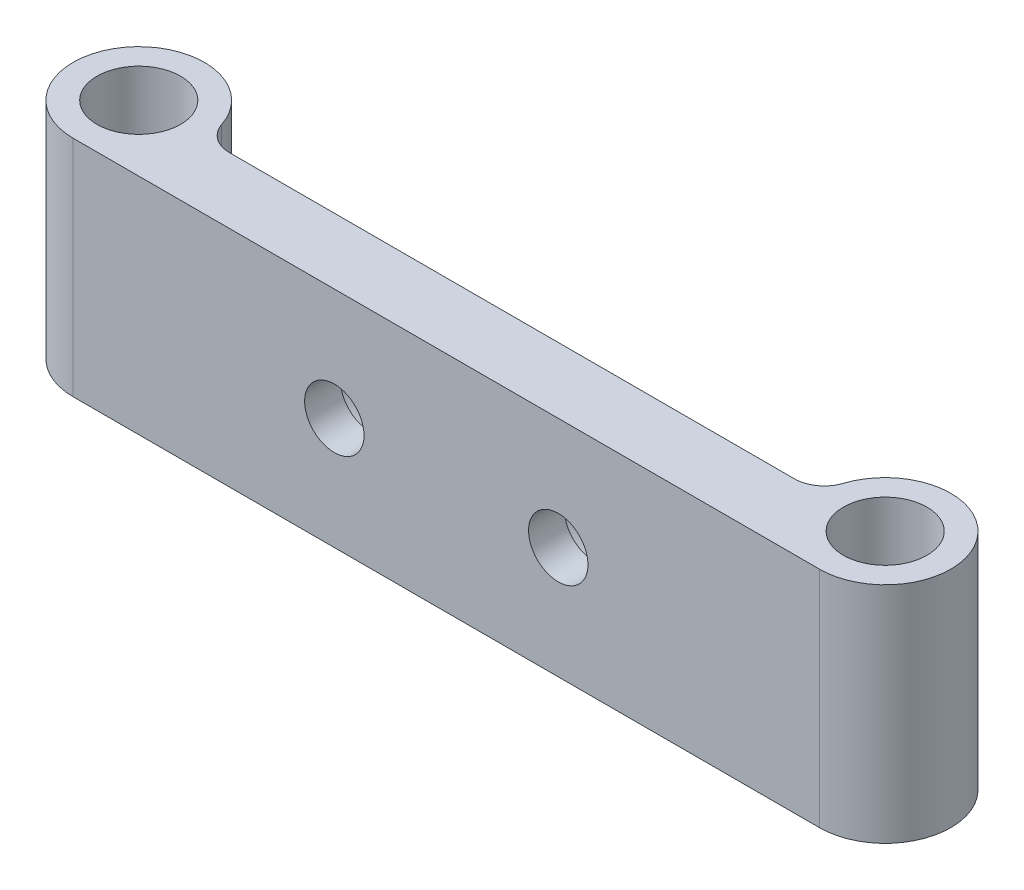
ISO-10303-21;
HEADER;
FILE_DESCRIPTION(('STEP AP214'),'2;1');
FILE_NAME('part.step','',(''),(''),'','','');
FILE_SCHEMA(('AUTOMOTIVE_DESIGN { 1 0 10303 214 1 1 1 1 }'));
ENDSEC;
DATA;
#1=APPLICATION_CONTEXT('core data for automotive mechanical design processes');
#2=APPLICATION_PROTOCOL_DEFINITION('international standard','automotive_design',2000,#1);
#3=PRODUCT_CONTEXT('',#1,'mechanical');
#4=PRODUCT('Part','Part','',(#3));
#5=PRODUCT_RELATED_PRODUCT_CATEGORY('part','',(#4));
#6=PRODUCT_DEFINITION_FORMATION('','',#4);
#7=PRODUCT_DEFINITION_CONTEXT('part definition',#1,'design');
#8=PRODUCT_DEFINITION('design','',#6,#7);
#9=PRODUCT_DEFINITION_SHAPE('','',#8);
#10=(LENGTH_UNIT() NAMED_UNIT(*) SI_UNIT(.MILLI.,.METRE.));
#11=(NAMED_UNIT(*) PLANE_ANGLE_UNIT() SI_UNIT($,.RADIAN.));
#12=(NAMED_UNIT(*) SI_UNIT($,.STERADIAN.) SOLID_ANGLE_UNIT());
#13=UNCERTAINTY_MEASURE_WITH_UNIT(LENGTH_MEASURE(1.E-05),#10,'distance_accuracy_value','');
#14=(GEOMETRIC_REPRESENTATION_CONTEXT(3) GLOBAL_UNCERTAINTY_ASSIGNED_CONTEXT((#13)) GLOBAL_UNIT_ASSIGNED_CONTEXT((#10,
#11,#12)) REPRESENTATION_CONTEXT('',''));
#15=CARTESIAN_POINT('',(0.,0.,0.));
#16=DIRECTION('',(0.,0.,1.));
#17=DIRECTION('',(1.,0.,0.));
#18=AXIS2_PLACEMENT_3D('',#15,#16,#17);
#19=CARTESIAN_POINT('',(9.525,9.525,0.));
#20=DIRECTION('',(0.,0.,1.));
#21=DIRECTION('',(1.,0.,0.));
#22=AXIS2_PLACEMENT_3D('',#19,#20,#21);
#23=CYLINDRICAL_SURFACE('',#22,2.5273);
#24=CARTESIAN_POINT('',(9.525,9.525,0.));
#25=DIRECTION('',(0.,0.,1.));
#26=DIRECTION('',(1.,0.,0.));
#27=AXIS2_PLACEMENT_3D('',#24,#25,#26);
#28=CIRCLE('',#27,2.5273);
#29=CARTESIAN_POINT('',(12.0523,9.525,0.));
#30=VERTEX_POINT('',#29);
#31=EDGE_CURVE('E155',#30,#30,#28,.T.);
#32=ORIENTED_EDGE('',*,*,#31,.T.);
#33=EDGE_LOOP('',(#32));
#34=FACE_BOUND('',#33,.T.);
#35=CARTESIAN_POINT('',(9.525,9.525,-3.04799999999999));
#36=DIRECTION('',(0.,0.,-1.));
#37=DIRECTION('',(-1.,0.,0.));
#38=AXIS2_PLACEMENT_3D('',#35,#36,#37);
#39=CIRCLE('',#38,2.5273);
#40=CARTESIAN_POINT('',(6.9977,9.525,-3.04799999999999));
#41=VERTEX_POINT('',#40);
#42=EDGE_CURVE('E43',#41,#41,#39,.F.);
#43=ORIENTED_EDGE('',*,*,#42,.F.);
#44=EDGE_LOOP('',(#43));
#45=FACE_BOUND('',#44,.T.);
#46=ADVANCED_FACE('F39',(#34,#45),#23,.F.);
#47=CARTESIAN_POINT('',(-9.525,9.525,0.));
#48=DIRECTION('',(0.,0.,1.));
#49=DIRECTION('',(1.,0.,0.));
#50=AXIS2_PLACEMENT_3D('',#47,#48,#49);
#51=CYLINDRICAL_SURFACE('',#50,2.5273);
#52=CARTESIAN_POINT('',(-9.525,9.525,0.));
#53=DIRECTION('',(0.,0.,1.));
#54=DIRECTION('',(1.,0.,0.));
#55=AXIS2_PLACEMENT_3D('',#52,#53,#54);
#56=CIRCLE('',#55,2.5273);
#57=CARTESIAN_POINT('',(-6.9977,9.525,0.));
#58=VERTEX_POINT('',#57);
#59=EDGE_CURVE('E138',#58,#58,#56,.T.);
#60=ORIENTED_EDGE('',*,*,#59,.T.);
#61=EDGE_LOOP('',(#60));
#62=FACE_BOUND('',#61,.T.);
#63=CARTESIAN_POINT('',(-9.525,9.525,-3.04799999999998));
#64=DIRECTION('',(0.,0.,-1.));
#65=DIRECTION('',(-1.,0.,0.));
#66=AXIS2_PLACEMENT_3D('',#63,#64,#65);
#67=CIRCLE('',#66,2.5273);
#68=CARTESIAN_POINT('',(-12.0523,9.525,-3.04799999999998));
#69=VERTEX_POINT('',#68);
#70=EDGE_CURVE('E132',#69,#69,#67,.F.);
#71=ORIENTED_EDGE('',*,*,#70,.F.);
#72=EDGE_LOOP('',(#71));
#73=FACE_BOUND('',#72,.T.);
#74=ADVANCED_FACE('F206',(#62,#73),#51,.F.);
#75=CARTESIAN_POINT('',(-31.75,19.05,-5.58799999999999));
#76=DIRECTION('',(0.,1.,0.));
#77=DIRECTION('',(0.,0.,1.));
#78=AXIS2_PLACEMENT_3D('',#75,#76,#77);
#79=PLANE('',#78);
#80=CARTESIAN_POINT('',(31.75,19.05,-5.588));
#81=DIRECTION('',(0.,1.,0.));
#82=DIRECTION('',(0.,0.,1.));
#83=AXIS2_PLACEMENT_3D('',#80,#81,#82);
#84=CIRCLE('',#83,3.556);
#85=CARTESIAN_POINT('',(31.75,19.05,-9.144));
#86=VERTEX_POINT('',#85);
#87=EDGE_CURVE('E165',#86,#86,#84,.T.);
#88=ORIENTED_EDGE('',*,*,#87,.F.);
#89=EDGE_LOOP('',(#88));
#90=FACE_BOUND('',#89,.T.);
#91=DIRECTION('',(-1.,0.,0.));
#92=VECTOR('',#91,1.);
#93=CARTESIAN_POINT('',(-26.162,19.05,-5.58799999999998));
#94=LINE('',#93,#92);
#95=CARTESIAN_POINT('',(24.0290684499861,19.05,-5.58799999999999));
#96=VERTEX_POINT('',#95);
#97=CARTESIAN_POINT('',(-24.0290684499861,19.05,-5.58799999999998));
#98=VERTEX_POINT('',#97);
#99=EDGE_CURVE('E118',#96,#98,#94,.T.);
#100=ORIENTED_EDGE('',*,*,#99,.T.);
#101=CARTESIAN_POINT('',(-24.0290684499861,19.05,-8.12799999999998));
#102=DIRECTION('',(0.,1.,0.));
#103=DIRECTION('',(0.,0.,1.));
#104=AXIS2_PLACEMENT_3D('',#101,#102,#103);
#105=CIRCLE('',#104,2.54);
#106=CARTESIAN_POINT('',(-26.4418595593655,19.05,-7.33424999999998));
#107=VERTEX_POINT('',#106);
#108=EDGE_CURVE('E11',#98,#107,#105,.F.);
#109=ORIENTED_EDGE('',*,*,#108,.T.);
#110=CARTESIAN_POINT('',(-31.75,19.05,-5.58799999999999));
#111=DIRECTION('',(0.,1.,0.));
#112=DIRECTION('',(0.,0.,1.));
#113=AXIS2_PLACEMENT_3D('',#110,#111,#112);
#114=CIRCLE('',#113,5.58799999999999);
#115=CARTESIAN_POINT('',(-31.75,19.05,0.));
#116=VERTEX_POINT('',#115);
#117=EDGE_CURVE('E90',#107,#116,#114,.T.);
#118=ORIENTED_EDGE('',*,*,#117,.T.);
#119=DIRECTION('',(1.,0.,0.));
#120=VECTOR('',#119,1.);
#121=CARTESIAN_POINT('',(-31.75,19.05,0.));
#122=LINE('',#121,#120);
#123=CARTESIAN_POINT('',(31.75,19.05,0.));
#124=VERTEX_POINT('',#123);
#125=EDGE_CURVE('E95',#116,#124,#122,.T.);
#126=ORIENTED_EDGE('',*,*,#125,.T.);
#127=CARTESIAN_POINT('',(31.75,19.05,-5.588));
#128=DIRECTION('',(0.,1.,0.));
#129=DIRECTION('',(0.,0.,1.));
#130=AXIS2_PLACEMENT_3D('',#127,#128,#129);
#131=CIRCLE('',#130,5.58799999999999);
#132=CARTESIAN_POINT('',(26.4418595593655,19.05,-7.33424999999999));
#133=VERTEX_POINT('',#132);
#134=EDGE_CURVE('E108',#124,#133,#131,.T.);
#135=ORIENTED_EDGE('',*,*,#134,.T.);
#136=CARTESIAN_POINT('',(24.0290684499861,19.05,-8.12799999999999));
#137=DIRECTION('',(0.,1.,0.));
#138=DIRECTION('',(0.,0.,1.));
#139=AXIS2_PLACEMENT_3D('',#136,#137,#138);
#140=CIRCLE('',#139,2.54);
#141=EDGE_CURVE('E130',#133,#96,#140,.F.);
#142=ORIENTED_EDGE('',*,*,#141,.T.);
#143=EDGE_LOOP('',(#100,#109,#118,#126,#135,#142));
#144=FACE_BOUND('',#143,.T.);
#145=CARTESIAN_POINT('',(-31.75,19.05,-5.58799999999999));
#146=DIRECTION('',(0.,1.,0.));
#147=DIRECTION('',(0.,0.,1.));
#148=AXIS2_PLACEMENT_3D('',#145,#146,#147);
#149=CIRCLE('',#148,3.556);
#150=CARTESIAN_POINT('',(-31.75,19.05,-9.14399999999999));
#151=VERTEX_POINT('',#150);
#152=EDGE_CURVE('E159',#151,#151,#149,.T.);
#153=ORIENTED_EDGE('',*,*,#152,.F.);
#154=EDGE_LOOP('',(#153));
#155=FACE_BOUND('',#154,.T.);
#156=ADVANCED_FACE('F92',(#90,#144,#155),#79,.T.);
#157=CARTESIAN_POINT('',(-31.75,0.,-5.58799999999999));
#158=DIRECTION('',(0.,1.,0.));
#159=DIRECTION('',(0.,0.,1.));
#160=AXIS2_PLACEMENT_3D('',#157,#158,#159);
#161=PLANE('',#160);
#162=CARTESIAN_POINT('',(-31.75,0.,-5.58799999999999));
#163=DIRECTION('',(0.,1.,0.));
#164=DIRECTION('',(0.,0.,1.));
#165=AXIS2_PLACEMENT_3D('',#162,#163,#164);
#166=CIRCLE('',#165,5.58799999999999);
#167=CARTESIAN_POINT('',(-26.4418595593655,0.,-7.33424999999998));
#168=VERTEX_POINT('',#167);
#169=CARTESIAN_POINT('',(-31.75,0.,0.));
#170=VERTEX_POINT('',#169);
#171=EDGE_CURVE('E112',#168,#170,#166,.T.);
#172=ORIENTED_EDGE('',*,*,#171,.F.);
#173=CARTESIAN_POINT('',(-24.0290684499861,0.,-8.12799999999998));
#174=DIRECTION('',(0.,1.,0.));
#175=DIRECTION('',(0.,0.,1.));
#176=AXIS2_PLACEMENT_3D('',#173,#174,#175);
#177=CIRCLE('',#176,2.54);
#178=CARTESIAN_POINT('',(-24.0290684499861,0.,-5.58799999999998));
#179=VERTEX_POINT('',#178);
#180=EDGE_CURVE('E48',#168,#179,#177,.T.);
#181=ORIENTED_EDGE('',*,*,#180,.T.);
#182=DIRECTION('',(-1.,0.,0.));
#183=VECTOR('',#182,1.);
#184=CARTESIAN_POINT('',(-26.162,0.,-5.58799999999998));
#185=LINE('',#184,#183);
#186=CARTESIAN_POINT('',(24.0290684499861,0.,-5.58799999999999));
#187=VERTEX_POINT('',#186);
#188=EDGE_CURVE('E99',#187,#179,#185,.T.);
#189=ORIENTED_EDGE('',*,*,#188,.F.);
#190=CARTESIAN_POINT('',(24.0290684499861,0.,-8.12799999999999));
#191=DIRECTION('',(0.,1.,0.));
#192=DIRECTION('',(0.,0.,1.));
#193=AXIS2_PLACEMENT_3D('',#190,#191,#192);
#194=CIRCLE('',#193,2.54);
#195=CARTESIAN_POINT('',(26.4418595593655,0.,-7.33424999999999));
#196=VERTEX_POINT('',#195);
#197=EDGE_CURVE('E128',#187,#196,#194,.T.);
#198=ORIENTED_EDGE('',*,*,#197,.T.);
#199=CARTESIAN_POINT('',(31.75,0.,-5.588));
#200=DIRECTION('',(0.,1.,0.));
#201=DIRECTION('',(0.,0.,1.));
#202=AXIS2_PLACEMENT_3D('',#199,#200,#201);
#203=CIRCLE('',#202,5.58799999999999);
#204=CARTESIAN_POINT('',(31.75,0.,0.));
#205=VERTEX_POINT('',#204);
#206=EDGE_CURVE('E175',#205,#196,#203,.T.);
#207=ORIENTED_EDGE('',*,*,#206,.F.);
#208=DIRECTION('',(1.,0.,0.));
#209=VECTOR('',#208,1.);
#210=CARTESIAN_POINT('',(-31.75,0.,0.));
#211=LINE('',#210,#209);
#212=EDGE_CURVE('E173',#170,#205,#211,.T.);
#213=ORIENTED_EDGE('',*,*,#212,.F.);
#214=EDGE_LOOP('',(#172,#181,#189,#198,#207,#213));
#215=FACE_BOUND('',#214,.T.);
#216=CARTESIAN_POINT('',(31.75,0.,-5.588));
#217=DIRECTION('',(0.,1.,0.));
#218=DIRECTION('',(0.,0.,1.));
#219=AXIS2_PLACEMENT_3D('',#216,#217,#218);
#220=CIRCLE('',#219,3.556);
#221=CARTESIAN_POINT('',(31.75,0.,-9.144));
#222=VERTEX_POINT('',#221);
#223=EDGE_CURVE('E162',#222,#222,#220,.T.);
#224=ORIENTED_EDGE('',*,*,#223,.T.);
#225=EDGE_LOOP('',(#224));
#226=FACE_BOUND('',#225,.T.);
#227=CARTESIAN_POINT('',(-31.75,0.,-5.58799999999999));
#228=DIRECTION('',(0.,1.,0.));
#229=DIRECTION('',(0.,0.,1.));
#230=AXIS2_PLACEMENT_3D('',#227,#228,#229);
#231=CIRCLE('',#230,3.556);
#232=CARTESIAN_POINT('',(-31.75,0.,-9.14399999999999));
#233=VERTEX_POINT('',#232);
#234=EDGE_CURVE('E158',#233,#233,#231,.T.);
#235=ORIENTED_EDGE('',*,*,#234,.T.);
#236=EDGE_LOOP('',(#235));
#237=FACE_BOUND('',#236,.T.);
#238=ADVANCED_FACE('F184',(#215,#226,#237),#161,.F.);
#239=CARTESIAN_POINT('',(-31.75,19.05,-5.58799999999999));
#240=DIRECTION('',(0.,-1.,0.));
#241=DIRECTION('',(0.,0.,-1.));
#242=AXIS2_PLACEMENT_3D('',#239,#240,#241);
#243=CYLINDRICAL_SURFACE('',#242,5.58799999999999);
#244=ORIENTED_EDGE('',*,*,#117,.F.);
#245=DIRECTION('',(0.,-1.,0.));
#246=VECTOR('',#245,1.);
#247=CARTESIAN_POINT('',(-26.4418595593654,19.05,-7.33424999999998));
#248=LINE('',#247,#246);
#249=EDGE_CURVE('E126',#107,#168,#248,.T.);
#250=ORIENTED_EDGE('',*,*,#249,.T.);
#251=ORIENTED_EDGE('',*,*,#171,.T.);
#252=DIRECTION('',(0.,-1.,0.));
#253=VECTOR('',#252,1.);
#254=CARTESIAN_POINT('',(-31.75,19.05,0.));
#255=LINE('',#254,#253);
#256=EDGE_CURVE('E104',#116,#170,#255,.T.);
#257=ORIENTED_EDGE('',*,*,#256,.F.);
#258=EDGE_LOOP('',(#244,#250,#251,#257));
#259=FACE_BOUND('',#258,.T.);
#260=ADVANCED_FACE('F110',(#259),#243,.T.);
#261=CARTESIAN_POINT('',(-31.75,19.05,0.));
#262=DIRECTION('',(0.,0.,-1.));
#263=DIRECTION('',(-1.,0.,0.));
#264=AXIS2_PLACEMENT_3D('',#261,#262,#263);
#265=PLANE('',#264);
#266=ORIENTED_EDGE('',*,*,#59,.F.);
#267=EDGE_LOOP('',(#266));
#268=FACE_BOUND('',#267,.T.);
#269=ORIENTED_EDGE('',*,*,#31,.F.);
#270=EDGE_LOOP('',(#269));
#271=FACE_BOUND('',#270,.T.);
#272=ORIENTED_EDGE('',*,*,#212,.T.);
#273=DIRECTION('',(0.,-1.,0.));
#274=VECTOR('',#273,1.);
#275=CARTESIAN_POINT('',(31.75,19.05,0.));
#276=LINE('',#275,#274);
#277=EDGE_CURVE('E106',#124,#205,#276,.T.);
#278=ORIENTED_EDGE('',*,*,#277,.F.);
#279=ORIENTED_EDGE('',*,*,#125,.F.);
#280=ORIENTED_EDGE('',*,*,#256,.T.);
#281=EDGE_LOOP('',(#272,#278,#279,#280));
#282=FACE_BOUND('',#281,.T.);
#283=ADVANCED_FACE('F103',(#268,#271,#282),#265,.F.);
#284=CARTESIAN_POINT('',(31.75,19.05,-5.588));
#285=DIRECTION('',(0.,-1.,0.));
#286=DIRECTION('',(0.,0.,-1.));
#287=AXIS2_PLACEMENT_3D('',#284,#285,#286);
#288=CYLINDRICAL_SURFACE('',#287,5.58799999999999);
#289=ORIENTED_EDGE('',*,*,#206,.T.);
#290=DIRECTION('',(0.,-1.,0.));
#291=VECTOR('',#290,1.);
#292=CARTESIAN_POINT('',(26.4418595593654,19.05,-7.33424999999999));
#293=LINE('',#292,#291);
#294=EDGE_CURVE('E124',#196,#133,#293,.F.);
#295=ORIENTED_EDGE('',*,*,#294,.T.);
#296=ORIENTED_EDGE('',*,*,#134,.F.);
#297=ORIENTED_EDGE('',*,*,#277,.T.);
#298=EDGE_LOOP('',(#289,#295,#296,#297));
#299=FACE_BOUND('',#298,.T.);
#300=ADVANCED_FACE('F188',(#299),#288,.T.);
#301=CARTESIAN_POINT('',(-26.162,19.05,-5.58799999999998));
#302=DIRECTION('',(0.,0.,1.));
#303=DIRECTION('',(1.,0.,0.));
#304=AXIS2_PLACEMENT_3D('',#301,#302,#303);
#305=PLANE('',#304);
#306=CARTESIAN_POINT('',(9.525,9.525,-5.58799999999999));
#307=DIRECTION('',(0.,0.,-1.));
#308=DIRECTION('',(-1.,0.,0.));
#309=AXIS2_PLACEMENT_3D('',#306,#307,#308);
#310=CIRCLE('',#309,5.08);
#311=CARTESIAN_POINT('',(4.445,9.525,-5.58799999999998));
#312=VERTEX_POINT('',#311);
#313=EDGE_CURVE('E140',#312,#312,#310,.T.);
#314=ORIENTED_EDGE('',*,*,#313,.F.);
#315=EDGE_LOOP('',(#314));
#316=FACE_BOUND('',#315,.T.);
#317=CARTESIAN_POINT('',(-9.525,9.525,-5.58799999999998));
#318=DIRECTION('',(0.,0.,-1.));
#319=DIRECTION('',(-1.,0.,0.));
#320=AXIS2_PLACEMENT_3D('',#317,#318,#319);
#321=CIRCLE('',#320,5.08);
#322=CARTESIAN_POINT('',(-14.605,9.525,-5.58799999999998));
#323=VERTEX_POINT('',#322);
#324=EDGE_CURVE('E150',#323,#323,#321,.T.);
#325=ORIENTED_EDGE('',*,*,#324,.F.);
#326=EDGE_LOOP('',(#325));
#327=FACE_BOUND('',#326,.T.);
#328=ORIENTED_EDGE('',*,*,#99,.F.);
#329=DIRECTION('',(0.,1.,0.));
#330=VECTOR('',#329,1.);
#331=CARTESIAN_POINT('',(24.0290684499861,0.,-5.58799999999999));
#332=LINE('',#331,#330);
#333=EDGE_CURVE('E116',#96,#187,#332,.F.);
#334=ORIENTED_EDGE('',*,*,#333,.T.);
#335=ORIENTED_EDGE('',*,*,#188,.T.);
#336=DIRECTION('',(0.,1.,0.));
#337=VECTOR('',#336,1.);
#338=CARTESIAN_POINT('',(-24.0290684499861,19.05,-5.58799999999998));
#339=LINE('',#338,#337);
#340=EDGE_CURVE('E114',#179,#98,#339,.T.);
#341=ORIENTED_EDGE('',*,*,#340,.T.);
#342=EDGE_LOOP('',(#328,#334,#335,#341));
#343=FACE_BOUND('',#342,.T.);
#344=ADVANCED_FACE('F181',(#316,#327,#343),#305,.F.);
#345=CARTESIAN_POINT('',(31.75,19.05,-5.588));
#346=DIRECTION('',(0.,-1.,0.));
#347=DIRECTION('',(0.,0.,-1.));
#348=AXIS2_PLACEMENT_3D('',#345,#346,#347);
#349=CYLINDRICAL_SURFACE('',#348,3.556);
#350=CARTESIAN_POINT('',(31.75,19.05,-9.144));
#351=CARTESIAN_POINT('',(31.75,18.8515625,-9.144));
#352=CARTESIAN_POINT('',(31.75,18.653125,-9.144));
#353=CARTESIAN_POINT('',(31.75,18.25625,-9.144));
#354=CARTESIAN_POINT('',(31.75,18.0578125,-9.144));
#355=CARTESIAN_POINT('',(31.75,17.6609375,-9.144));
#356=CARTESIAN_POINT('',(31.75,17.4625,-9.144));
#357=CARTESIAN_POINT('',(31.75,17.065625,-9.144));
#358=CARTESIAN_POINT('',(31.75,16.8671875,-9.144));
#359=CARTESIAN_POINT('',(31.75,16.4703125,-9.144));
#360=CARTESIAN_POINT('',(31.75,16.271875,-9.144));
#361=CARTESIAN_POINT('',(31.75,15.875,-9.144));
#362=CARTESIAN_POINT('',(31.75,15.6765625,-9.144));
#363=CARTESIAN_POINT('',(31.75,15.2796875,-9.144));
#364=CARTESIAN_POINT('',(31.75,15.08125,-9.144));
#365=CARTESIAN_POINT('',(31.75,14.684375,-9.144));
#366=CARTESIAN_POINT('',(31.75,14.4859375,-9.144));
#367=CARTESIAN_POINT('',(31.75,14.0890625,-9.144));
#368=CARTESIAN_POINT('',(31.75,13.890625,-9.144));
#369=CARTESIAN_POINT('',(31.75,13.49375,-9.144));
#370=CARTESIAN_POINT('',(31.75,13.2953125,-9.144));
#371=CARTESIAN_POINT('',(31.75,12.8984375,-9.144));
#372=CARTESIAN_POINT('',(31.75,12.7,-9.144));
#373=CARTESIAN_POINT('',(31.75,12.303125,-9.144));
#374=CARTESIAN_POINT('',(31.75,12.1046875,-9.144));
#375=CARTESIAN_POINT('',(31.75,11.7078125,-9.144));
#376=CARTESIAN_POINT('',(31.75,11.509375,-9.144));
#377=CARTESIAN_POINT('',(31.75,11.1125,-9.144));
#378=CARTESIAN_POINT('',(31.75,10.9140625,-9.144));
#379=CARTESIAN_POINT('',(31.75,10.5171875,-9.144));
#380=CARTESIAN_POINT('',(31.75,10.31875,-9.144));
#381=CARTESIAN_POINT('',(31.75,9.921875,-9.144));
#382=CARTESIAN_POINT('',(31.75,9.7234375,-9.144));
#383=CARTESIAN_POINT('',(31.75,9.3265625,-9.144));
#384=CARTESIAN_POINT('',(31.75,9.128125,-9.144));
#385=CARTESIAN_POINT('',(31.75,8.73125,-9.144));
#386=CARTESIAN_POINT('',(31.75,8.5328125,-9.144));
#387=CARTESIAN_POINT('',(31.75,8.1359375,-9.144));
#388=CARTESIAN_POINT('',(31.75,7.9375,-9.144));
#389=CARTESIAN_POINT('',(31.75,7.540625,-9.144));
#390=CARTESIAN_POINT('',(31.75,7.3421875,-9.144));
#391=CARTESIAN_POINT('',(31.75,6.9453125,-9.144));
#392=CARTESIAN_POINT('',(31.75,6.746875,-9.144));
#393=CARTESIAN_POINT('',(31.75,6.35,-9.144));
#394=CARTESIAN_POINT('',(31.75,6.1515625,-9.144));
#395=CARTESIAN_POINT('',(31.75,5.7546875,-9.144));
#396=CARTESIAN_POINT('',(31.75,5.55625,-9.144));
#397=CARTESIAN_POINT('',(31.75,5.159375,-9.144));
#398=CARTESIAN_POINT('',(31.75,4.9609375,-9.144));
#399=CARTESIAN_POINT('',(31.75,4.5640625,-9.144));
#400=CARTESIAN_POINT('',(31.75,4.365625,-9.144));
#401=CARTESIAN_POINT('',(31.75,3.96875,-9.144));
#402=CARTESIAN_POINT('',(31.75,3.7703125,-9.144));
#403=CARTESIAN_POINT('',(31.75,3.3734375,-9.144));
#404=CARTESIAN_POINT('',(31.75,3.175,-9.144));
#405=CARTESIAN_POINT('',(31.75,2.778125,-9.144));
#406=CARTESIAN_POINT('',(31.75,2.5796875,-9.144));
#407=CARTESIAN_POINT('',(31.75,2.1828125,-9.144));
#408=CARTESIAN_POINT('',(31.75,1.984375,-9.144));
#409=CARTESIAN_POINT('',(31.75,1.5875,-9.144));
#410=CARTESIAN_POINT('',(31.75,1.3890625,-9.144));
#411=CARTESIAN_POINT('',(31.75,0.992187500000001,-9.144));
#412=CARTESIAN_POINT('',(31.75,0.793750000000001,-9.144));
#413=CARTESIAN_POINT('',(31.75,0.396875,-9.144));
#414=CARTESIAN_POINT('',(31.75,0.1984375,-9.144));
#415=CARTESIAN_POINT('',(31.75,0.,-9.144));
#416=B_SPLINE_CURVE_WITH_KNOTS('',3,(#350,#351,#352,#353,#354,#355,#356,#357,#358,#359,#360,
#361,#362,#363,#364,#365,#366,#367,#368,#369,#370,#371,#372,#373,#374,#375,#376,#377,#378,#379,
#380,#381,#382,#383,#384,#385,#386,#387,#388,#389,#390,#391,#392,#393,#394,#395,#396,#397,#398,
#399,#400,#401,#402,#403,#404,#405,#406,#407,#408,#409,#410,#411,#412,#413,#414,#415),
.UNSPECIFIED.,.F.,.F.,(4,2,2,2,2,2,2,2,2,2,2,2,2,2,2,2,2,2,2,2,2,2,2,2,2,2,2,2,2,2,2,2,4),(0.,
0.5953125,1.190625,1.7859375,2.38125,2.9765625,3.571875,4.1671875,4.7625,5.3578125,5.953125,
6.5484375,7.14375,7.7390625,8.334375,8.9296875,9.525,10.1203125,10.715625,11.3109375,11.90625,
12.5015625,13.096875,13.6921875,14.2875,14.8828125,15.478125,16.0734375,16.66875,17.2640625,
17.859375,18.4546875,19.05),.UNSPECIFIED.);
#417=EDGE_CURVE('BSEAM201',#86,#222,#416,.T.);
#418=ORIENTED_EDGE('',*,*,#87,.T.);
#419=ORIENTED_EDGE('',*,*,#223,.F.);
#420=ORIENTED_EDGE('',*,*,#417,.T.);
#421=ORIENTED_EDGE('',*,*,#417,.F.);
#422=EDGE_LOOP('',(#418,#420,#419,#421));
#423=FACE_BOUND('',#422,.T.);
#424=ADVANCED_FACE('F201',(#423),#349,.F.);
#425=CARTESIAN_POINT('',(-31.75,19.05,-5.58799999999999));
#426=DIRECTION('',(0.,-1.,0.));
#427=DIRECTION('',(0.,0.,-1.));
#428=AXIS2_PLACEMENT_3D('',#425,#426,#427);
#429=CYLINDRICAL_SURFACE('',#428,3.556);
#430=CARTESIAN_POINT('',(-31.75,19.05,-9.14399999999999));
#431=CARTESIAN_POINT('',(-31.75,18.8515625,-9.14399999999999));
#432=CARTESIAN_POINT('',(-31.75,18.653125,-9.14399999999999));
#433=CARTESIAN_POINT('',(-31.75,18.25625,-9.14399999999999));
#434=CARTESIAN_POINT('',(-31.75,18.0578125,-9.14399999999999));
#435=CARTESIAN_POINT('',(-31.75,17.6609375,-9.14399999999999));
#436=CARTESIAN_POINT('',(-31.75,17.4625,-9.14399999999999));
#437=CARTESIAN_POINT('',(-31.75,17.065625,-9.14399999999999));
#438=CARTESIAN_POINT('',(-31.75,16.8671875,-9.14399999999999));
#439=CARTESIAN_POINT('',(-31.75,16.4703125,-9.14399999999999));
#440=CARTESIAN_POINT('',(-31.75,16.271875,-9.14399999999999));
#441=CARTESIAN_POINT('',(-31.75,15.875,-9.14399999999999));
#442=CARTESIAN_POINT('',(-31.75,15.6765625,-9.14399999999999));
#443=CARTESIAN_POINT('',(-31.75,15.2796875,-9.14399999999999));
#444=CARTESIAN_POINT('',(-31.75,15.08125,-9.14399999999999));
#445=CARTESIAN_POINT('',(-31.75,14.684375,-9.14399999999999));
#446=CARTESIAN_POINT('',(-31.75,14.4859375,-9.14399999999999));
#447=CARTESIAN_POINT('',(-31.75,14.0890625,-9.14399999999999));
#448=CARTESIAN_POINT('',(-31.75,13.890625,-9.14399999999999));
#449=CARTESIAN_POINT('',(-31.75,13.49375,-9.14399999999999));
#450=CARTESIAN_POINT('',(-31.75,13.2953125,-9.14399999999999));
#451=CARTESIAN_POINT('',(-31.75,12.8984375,-9.14399999999999));
#452=CARTESIAN_POINT('',(-31.75,12.7,-9.14399999999999));
#453=CARTESIAN_POINT('',(-31.75,12.303125,-9.14399999999999));
#454=CARTESIAN_POINT('',(-31.75,12.1046875,-9.14399999999999));
#455=CARTESIAN_POINT('',(-31.75,11.7078125,-9.14399999999999));
#456=CARTESIAN_POINT('',(-31.75,11.509375,-9.14399999999999));
#457=CARTESIAN_POINT('',(-31.75,11.1125,-9.14399999999999));
#458=CARTESIAN_POINT('',(-31.75,10.9140625,-9.14399999999999));
#459=CARTESIAN_POINT('',(-31.75,10.5171875,-9.14399999999999));
#460=CARTESIAN_POINT('',(-31.75,10.31875,-9.14399999999999));
#461=CARTESIAN_POINT('',(-31.75,9.921875,-9.14399999999999));
#462=CARTESIAN_POINT('',(-31.75,9.7234375,-9.14399999999999));
#463=CARTESIAN_POINT('',(-31.75,9.3265625,-9.14399999999999));
#464=CARTESIAN_POINT('',(-31.75,9.128125,-9.14399999999999));
#465=CARTESIAN_POINT('',(-31.75,8.73125,-9.14399999999999));
#466=CARTESIAN_POINT('',(-31.75,8.5328125,-9.14399999999999));
#467=CARTESIAN_POINT('',(-31.75,8.1359375,-9.14399999999999));
#468=CARTESIAN_POINT('',(-31.75,7.9375,-9.14399999999999));
#469=CARTESIAN_POINT('',(-31.75,7.540625,-9.14399999999999));
#470=CARTESIAN_POINT('',(-31.75,7.3421875,-9.14399999999999));
#471=CARTESIAN_POINT('',(-31.75,6.9453125,-9.14399999999999));
#472=CARTESIAN_POINT('',(-31.75,6.746875,-9.14399999999999));
#473=CARTESIAN_POINT('',(-31.75,6.35,-9.14399999999999));
#474=CARTESIAN_POINT('',(-31.75,6.1515625,-9.14399999999999));
#475=CARTESIAN_POINT('',(-31.75,5.7546875,-9.14399999999999));
#476=CARTESIAN_POINT('',(-31.75,5.55625,-9.14399999999999));
#477=CARTESIAN_POINT('',(-31.75,5.159375,-9.14399999999999));
#478=CARTESIAN_POINT('',(-31.75,4.9609375,-9.14399999999999));
#479=CARTESIAN_POINT('',(-31.75,4.5640625,-9.14399999999999));
#480=CARTESIAN_POINT('',(-31.75,4.365625,-9.14399999999999));
#481=CARTESIAN_POINT('',(-31.75,3.96875,-9.14399999999999));
#482=CARTESIAN_POINT('',(-31.75,3.7703125,-9.14399999999999));
#483=CARTESIAN_POINT('',(-31.75,3.3734375,-9.14399999999999));
#484=CARTESIAN_POINT('',(-31.75,3.175,-9.14399999999999));
#485=CARTESIAN_POINT('',(-31.75,2.778125,-9.14399999999999));
#486=CARTESIAN_POINT('',(-31.75,2.5796875,-9.14399999999999));
#487=CARTESIAN_POINT('',(-31.75,2.1828125,-9.14399999999999));
#488=CARTESIAN_POINT('',(-31.75,1.984375,-9.14399999999999));
#489=CARTESIAN_POINT('',(-31.75,1.5875,-9.14399999999999));
#490=CARTESIAN_POINT('',(-31.75,1.3890625,-9.14399999999999));
#491=CARTESIAN_POINT('',(-31.75,0.992187500000001,-9.14399999999999));
#492=CARTESIAN_POINT('',(-31.75,0.793750000000001,-9.14399999999999));
#493=CARTESIAN_POINT('',(-31.75,0.396875,-9.14399999999999));
#494=CARTESIAN_POINT('',(-31.75,0.1984375,-9.14399999999999));
#495=CARTESIAN_POINT('',(-31.75,0.,-9.14399999999999));
#496=B_SPLINE_CURVE_WITH_KNOTS('',3,(#430,#431,#432,#433,#434,#435,#436,#437,#438,#439,#440,
#441,#442,#443,#444,#445,#446,#447,#448,#449,#450,#451,#452,#453,#454,#455,#456,#457,#458,#459,
#460,#461,#462,#463,#464,#465,#466,#467,#468,#469,#470,#471,#472,#473,#474,#475,#476,#477,#478,
#479,#480,#481,#482,#483,#484,#485,#486,#487,#488,#489,#490,#491,#492,#493,#494,#495),
.UNSPECIFIED.,.F.,.F.,(4,2,2,2,2,2,2,2,2,2,2,2,2,2,2,2,2,2,2,2,2,2,2,2,2,2,2,2,2,2,2,2,4),(0.,
0.5953125,1.190625,1.7859375,2.38125,2.9765625,3.571875,4.1671875,4.7625,5.3578125,5.953125,
6.5484375,7.14375,7.7390625,8.334375,8.9296875,9.525,10.1203125,10.715625,11.3109375,11.90625,
12.5015625,13.096875,13.6921875,14.2875,14.8828125,15.478125,16.0734375,16.66875,17.2640625,
17.859375,18.4546875,19.05),.UNSPECIFIED.);
#497=EDGE_CURVE('BSEAM194',#151,#233,#496,.T.);
#498=ORIENTED_EDGE('',*,*,#152,.T.);
#499=ORIENTED_EDGE('',*,*,#234,.F.);
#500=ORIENTED_EDGE('',*,*,#497,.T.);
#501=ORIENTED_EDGE('',*,*,#497,.F.);
#502=EDGE_LOOP('',(#498,#500,#499,#501));
#503=FACE_BOUND('',#502,.T.);
#504=ADVANCED_FACE('F194',(#503),#429,.F.);
#505=CARTESIAN_POINT('',(24.0290684499861,19.05,-8.12799999999999));
#506=DIRECTION('',(0.,-1.,0.));
#507=DIRECTION('',(0.,0.,-1.));
#508=AXIS2_PLACEMENT_3D('',#505,#506,#507);
#509=CYLINDRICAL_SURFACE('',#508,2.54);
#510=ORIENTED_EDGE('',*,*,#141,.F.);
#511=ORIENTED_EDGE('',*,*,#294,.F.);
#512=ORIENTED_EDGE('',*,*,#197,.F.);
#513=ORIENTED_EDGE('',*,*,#333,.F.);
#514=EDGE_LOOP('',(#510,#511,#512,#513));
#515=FACE_BOUND('',#514,.T.);
#516=ADVANCED_FACE('F192',(#515),#509,.F.);
#517=CARTESIAN_POINT('',(-24.0290684499861,19.05,-8.12799999999998));
#518=DIRECTION('',(0.,-1.,0.));
#519=DIRECTION('',(0.,0.,-1.));
#520=AXIS2_PLACEMENT_3D('',#517,#518,#519);
#521=CYLINDRICAL_SURFACE('',#520,2.54);
#522=ORIENTED_EDGE('',*,*,#108,.F.);
#523=ORIENTED_EDGE('',*,*,#340,.F.);
#524=ORIENTED_EDGE('',*,*,#180,.F.);
#525=ORIENTED_EDGE('',*,*,#249,.F.);
#526=EDGE_LOOP('',(#522,#523,#524,#525));
#527=FACE_BOUND('',#526,.T.);
#528=ADVANCED_FACE('F41',(#527),#521,.F.);
#529=CARTESIAN_POINT('',(-9.525,9.525,-3.04799999999998));
#530=DIRECTION('',(0.,0.,-1.));
#531=DIRECTION('',(-1.,0.,0.));
#532=AXIS2_PLACEMENT_3D('',#529,#530,#531);
#533=PLANE('',#532);
#534=CARTESIAN_POINT('',(-9.525,9.525,-3.04799999999998));
#535=DIRECTION('',(0.,0.,-1.));
#536=DIRECTION('',(-1.,0.,0.));
#537=AXIS2_PLACEMENT_3D('',#534,#535,#536);
#538=CIRCLE('',#537,5.08);
#539=CARTESIAN_POINT('',(-14.605,9.525,-3.04799999999998));
#540=VERTEX_POINT('',#539);
#541=EDGE_CURVE('E145',#540,#540,#538,.T.);
#542=ORIENTED_EDGE('',*,*,#541,.T.);
#543=EDGE_LOOP('',(#542));
#544=FACE_BOUND('',#543,.T.);
#545=ORIENTED_EDGE('',*,*,#70,.T.);
#546=EDGE_LOOP('',(#545));
#547=FACE_BOUND('',#546,.T.);
#548=ADVANCED_FACE('F199',(#544,#547),#533,.T.);
#549=CARTESIAN_POINT('',(-9.525,9.525,-3.04799999999998));
#550=DIRECTION('',(0.,0.,-1.));
#551=DIRECTION('',(-1.,0.,0.));
#552=AXIS2_PLACEMENT_3D('',#549,#550,#551);
#553=CYLINDRICAL_SURFACE('',#552,5.08);
#554=ORIENTED_EDGE('',*,*,#541,.F.);
#555=EDGE_LOOP('',(#554));
#556=FACE_BOUND('',#555,.T.);
#557=ORIENTED_EDGE('',*,*,#324,.T.);
#558=EDGE_LOOP('',(#557));
#559=FACE_BOUND('',#558,.T.);
#560=ADVANCED_FACE('F274',(#556,#559),#553,.F.);
#561=CARTESIAN_POINT('',(9.525,9.525,-3.04799999999999));
#562=DIRECTION('',(0.,0.,-1.));
#563=DIRECTION('',(-1.,0.,0.));
#564=AXIS2_PLACEMENT_3D('',#561,#562,#563);
#565=PLANE('',#564);
#566=CARTESIAN_POINT('',(9.525,9.525,-3.04799999999999));
#567=DIRECTION('',(0.,0.,-1.));
#568=DIRECTION('',(-1.,0.,0.));
#569=AXIS2_PLACEMENT_3D('',#566,#567,#568);
#570=CIRCLE('',#569,5.08);
#571=CARTESIAN_POINT('',(4.445,9.525,-3.04799999999999));
#572=VERTEX_POINT('',#571);
#573=EDGE_CURVE('E134',#572,#572,#570,.T.);
#574=ORIENTED_EDGE('',*,*,#573,.T.);
#575=EDGE_LOOP('',(#574));
#576=FACE_BOUND('',#575,.T.);
#577=ORIENTED_EDGE('',*,*,#42,.T.);
#578=EDGE_LOOP('',(#577));
#579=FACE_BOUND('',#578,.T.);
#580=ADVANCED_FACE('F282',(#576,#579),#565,.T.);
#581=CARTESIAN_POINT('',(9.525,9.525,-3.04799999999999));
#582=DIRECTION('',(0.,0.,-1.));
#583=DIRECTION('',(-1.,0.,0.));
#584=AXIS2_PLACEMENT_3D('',#581,#582,#583);
#585=CYLINDRICAL_SURFACE('',#584,5.08);
#586=ORIENTED_EDGE('',*,*,#573,.F.);
#587=EDGE_LOOP('',(#586));
#588=FACE_BOUND('',#587,.T.);
#589=ORIENTED_EDGE('',*,*,#313,.T.);
#590=EDGE_LOOP('',(#589));
#591=FACE_BOUND('',#590,.T.);
#592=ADVANCED_FACE('F289',(#588,#591),#585,.F.);
#593=CLOSED_SHELL('',(#46,#74,#156,#238,#260,#283,#300,#344,#424,#504,#516,#528,#548,#560,#580,#592));
#594=MANIFOLD_SOLID_BREP('B2',#593);
#595=ADVANCED_BREP_SHAPE_REPRESENTATION('',(#18,#594),#14);
#596=SHAPE_DEFINITION_REPRESENTATION(#9,#595);
ENDSEC;
END-ISO-10303-21;
